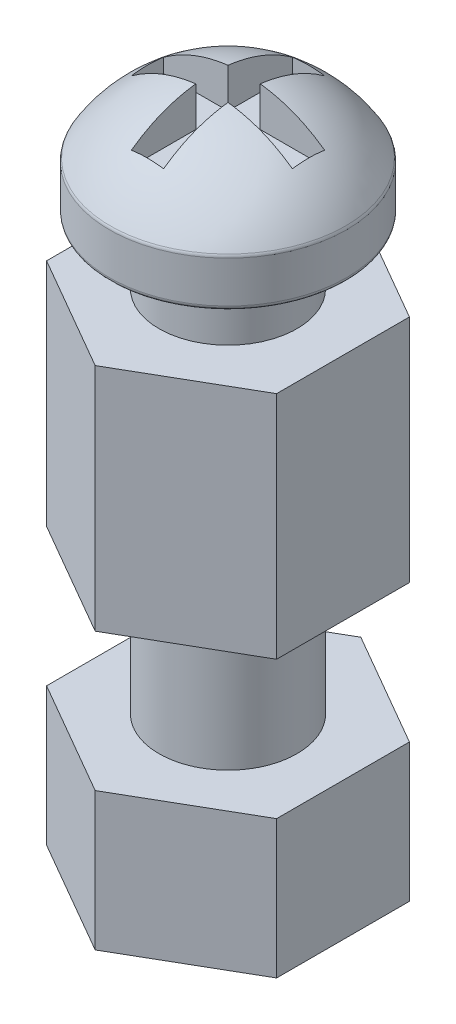
ISO-10303-21;
HEADER;
FILE_DESCRIPTION(('STEP AP214'),'2;1');
FILE_NAME('part.step','',(''),(''),'','','');
FILE_SCHEMA(('AUTOMOTIVE_DESIGN { 1 0 10303 214 1 1 1 1 }'));
ENDSEC;
DATA;
#1=APPLICATION_CONTEXT('core data for automotive mechanical design processes');
#2=APPLICATION_PROTOCOL_DEFINITION('international standard','automotive_design',2000,#1);
#3=PRODUCT_CONTEXT('',#1,'mechanical');
#4=PRODUCT('Part','Part','',(#3));
#5=PRODUCT_RELATED_PRODUCT_CATEGORY('part','',(#4));
#6=PRODUCT_DEFINITION_FORMATION('','',#4);
#7=PRODUCT_DEFINITION_CONTEXT('part definition',#1,'design');
#8=PRODUCT_DEFINITION('design','',#6,#7);
#9=PRODUCT_DEFINITION_SHAPE('','',#8);
#10=(LENGTH_UNIT() NAMED_UNIT(*) SI_UNIT(.MILLI.,.METRE.));
#11=(NAMED_UNIT(*) PLANE_ANGLE_UNIT() SI_UNIT($,.RADIAN.));
#12=(NAMED_UNIT(*) SI_UNIT($,.STERADIAN.) SOLID_ANGLE_UNIT());
#13=UNCERTAINTY_MEASURE_WITH_UNIT(LENGTH_MEASURE(1.E-05),#10,'distance_accuracy_value','');
#14=(GEOMETRIC_REPRESENTATION_CONTEXT(3) GLOBAL_UNCERTAINTY_ASSIGNED_CONTEXT((#13)) GLOBAL_UNIT_ASSIGNED_CONTEXT((#10,
#11,#12)) REPRESENTATION_CONTEXT('',''));
#15=CARTESIAN_POINT('',(0.,0.,0.));
#16=DIRECTION('',(0.,0.,1.));
#17=DIRECTION('',(1.,0.,0.));
#18=AXIS2_PLACEMENT_3D('',#15,#16,#17);
#19=CARTESIAN_POINT('',(2.5,-3.,-1.44337567297407));
#20=DIRECTION('',(1.,0.,0.));
#21=DIRECTION('',(0.,0.,-1.));
#22=AXIS2_PLACEMENT_3D('',#19,#20,#21);
#23=PLANE('',#22);
#24=DIRECTION('',(0.,0.,1.));
#25=VECTOR('',#24,1.);
#26=CARTESIAN_POINT('',(2.5,-6.,-1.44337567297407));
#27=LINE('',#26,#25);
#28=CARTESIAN_POINT('',(2.5,-6.,-1.44337567297407));
#29=VERTEX_POINT('',#28);
#30=CARTESIAN_POINT('',(2.5,-6.,1.44337567297407));
#31=VERTEX_POINT('',#30);
#32=EDGE_CURVE('E136',#29,#31,#27,.T.);
#33=ORIENTED_EDGE('',*,*,#32,.F.);
#34=DIRECTION('',(0.,-1.,0.));
#35=VECTOR('',#34,1.);
#36=CARTESIAN_POINT('',(2.5,-3.,-1.44337567297407));
#37=LINE('',#36,#35);
#38=CARTESIAN_POINT('',(2.5,-3.,-1.44337567297407));
#39=VERTEX_POINT('',#38);
#40=EDGE_CURVE('E12',#39,#29,#37,.T.);
#41=ORIENTED_EDGE('',*,*,#40,.F.);
#42=DIRECTION('',(0.,0.,1.));
#43=VECTOR('',#42,1.);
#44=CARTESIAN_POINT('',(2.5,-3.,-1.44337567297407));
#45=LINE('',#44,#43);
#46=CARTESIAN_POINT('',(2.5,-3.,1.44337567297407));
#47=VERTEX_POINT('',#46);
#48=EDGE_CURVE('E151',#39,#47,#45,.T.);
#49=ORIENTED_EDGE('',*,*,#48,.T.);
#50=DIRECTION('',(0.,-1.,0.));
#51=VECTOR('',#50,1.);
#52=CARTESIAN_POINT('',(2.5,-3.,1.44337567297407));
#53=LINE('',#52,#51);
#54=EDGE_CURVE('E54',#47,#31,#53,.T.);
#55=ORIENTED_EDGE('',*,*,#54,.T.);
#56=EDGE_LOOP('',(#33,#41,#49,#55));
#57=FACE_BOUND('',#56,.T.);
#58=ADVANCED_FACE('F51',(#57),#23,.T.);
#59=CARTESIAN_POINT('',(0.,-3.,-2.88675134594813));
#60=DIRECTION('',(0.5,0.,-0.866025403784439));
#61=DIRECTION('',(-0.866025403784439,0.,-0.5));
#62=AXIS2_PLACEMENT_3D('',#59,#60,#61);
#63=PLANE('',#62);
#64=DIRECTION('',(0.866025403784439,0.,0.5));
#65=VECTOR('',#64,1.);
#66=CARTESIAN_POINT('',(0.,-6.,-2.88675134594813));
#67=LINE('',#66,#65);
#68=CARTESIAN_POINT('',(0.,-6.,-2.88675134594813));
#69=VERTEX_POINT('',#68);
#70=EDGE_CURVE('E149',#69,#29,#67,.T.);
#71=ORIENTED_EDGE('',*,*,#70,.F.);
#72=DIRECTION('',(0.,-1.,0.));
#73=VECTOR('',#72,1.);
#74=CARTESIAN_POINT('',(0.,-3.,-2.88675134594813));
#75=LINE('',#74,#73);
#76=CARTESIAN_POINT('',(0.,-3.,-2.88675134594813));
#77=VERTEX_POINT('',#76);
#78=EDGE_CURVE('E60',#77,#69,#75,.T.);
#79=ORIENTED_EDGE('',*,*,#78,.F.);
#80=DIRECTION('',(0.866025403784439,0.,0.5));
#81=VECTOR('',#80,1.);
#82=CARTESIAN_POINT('',(0.,-3.,-2.88675134594813));
#83=LINE('',#82,#81);
#84=EDGE_CURVE('E126',#77,#39,#83,.T.);
#85=ORIENTED_EDGE('',*,*,#84,.T.);
#86=ORIENTED_EDGE('',*,*,#40,.T.);
#87=EDGE_LOOP('',(#71,#79,#85,#86));
#88=FACE_BOUND('',#87,.T.);
#89=ADVANCED_FACE('F159',(#88),#63,.T.);
#90=CARTESIAN_POINT('',(-2.5,-3.,-1.44337567297406));
#91=DIRECTION('',(-0.5,0.,-0.866025403784439));
#92=DIRECTION('',(-0.866025403784439,0.,0.5));
#93=AXIS2_PLACEMENT_3D('',#90,#91,#92);
#94=PLANE('',#93);
#95=DIRECTION('',(0.866025403784439,0.,-0.5));
#96=VECTOR('',#95,1.);
#97=CARTESIAN_POINT('',(-2.5,-6.,-1.44337567297406));
#98=LINE('',#97,#96);
#99=CARTESIAN_POINT('',(-2.5,-6.,-1.44337567297406));
#100=VERTEX_POINT('',#99);
#101=EDGE_CURVE('E113',#100,#69,#98,.T.);
#102=ORIENTED_EDGE('',*,*,#101,.F.);
#103=DIRECTION('',(0.,-1.,0.));
#104=VECTOR('',#103,1.);
#105=CARTESIAN_POINT('',(-2.5,-3.,-1.44337567297406));
#106=LINE('',#105,#104);
#107=CARTESIAN_POINT('',(-2.5,-3.,-1.44337567297406));
#108=VERTEX_POINT('',#107);
#109=EDGE_CURVE('E108',#108,#100,#106,.T.);
#110=ORIENTED_EDGE('',*,*,#109,.F.);
#111=DIRECTION('',(0.866025403784439,0.,-0.5));
#112=VECTOR('',#111,1.);
#113=CARTESIAN_POINT('',(-2.5,-3.,-1.44337567297406));
#114=LINE('',#113,#112);
#115=EDGE_CURVE('E111',#108,#77,#114,.T.);
#116=ORIENTED_EDGE('',*,*,#115,.T.);
#117=ORIENTED_EDGE('',*,*,#78,.T.);
#118=EDGE_LOOP('',(#102,#110,#116,#117));
#119=FACE_BOUND('',#118,.T.);
#120=ADVANCED_FACE('F110',(#119),#94,.T.);
#121=CARTESIAN_POINT('',(-2.5,-3.,1.44337567297406));
#122=DIRECTION('',(-1.,0.,0.));
#123=DIRECTION('',(0.,0.,1.));
#124=AXIS2_PLACEMENT_3D('',#121,#122,#123);
#125=PLANE('',#124);
#126=DIRECTION('',(0.,0.,-1.));
#127=VECTOR('',#126,1.);
#128=CARTESIAN_POINT('',(-2.5,-6.,1.44337567297406));
#129=LINE('',#128,#127);
#130=CARTESIAN_POINT('',(-2.5,-6.,1.44337567297406));
#131=VERTEX_POINT('',#130);
#132=EDGE_CURVE('E146',#131,#100,#129,.T.);
#133=ORIENTED_EDGE('',*,*,#132,.F.);
#134=DIRECTION('',(0.,-1.,0.));
#135=VECTOR('',#134,1.);
#136=CARTESIAN_POINT('',(-2.5,-3.,1.44337567297406));
#137=LINE('',#136,#135);
#138=CARTESIAN_POINT('',(-2.5,-3.,1.44337567297406));
#139=VERTEX_POINT('',#138);
#140=EDGE_CURVE('E118',#139,#131,#137,.T.);
#141=ORIENTED_EDGE('',*,*,#140,.F.);
#142=DIRECTION('',(0.,0.,-1.));
#143=VECTOR('',#142,1.);
#144=CARTESIAN_POINT('',(-2.5,-3.,1.44337567297406));
#145=LINE('',#144,#143);
#146=EDGE_CURVE('E124',#139,#108,#145,.T.);
#147=ORIENTED_EDGE('',*,*,#146,.T.);
#148=ORIENTED_EDGE('',*,*,#109,.T.);
#149=EDGE_LOOP('',(#133,#141,#147,#148));
#150=FACE_BOUND('',#149,.T.);
#151=ADVANCED_FACE('F128',(#150),#125,.T.);
#152=CARTESIAN_POINT('',(0.,-3.,2.88675134594813));
#153=DIRECTION('',(-0.5,0.,0.866025403784439));
#154=DIRECTION('',(0.866025403784439,0.,0.5));
#155=AXIS2_PLACEMENT_3D('',#152,#153,#154);
#156=PLANE('',#155);
#157=DIRECTION('',(-0.866025403784439,0.,-0.5));
#158=VECTOR('',#157,1.);
#159=CARTESIAN_POINT('',(0.,-6.,2.88675134594813));
#160=LINE('',#159,#158);
#161=CARTESIAN_POINT('',(0.,-6.,2.88675134594813));
#162=VERTEX_POINT('',#161);
#163=EDGE_CURVE('E143',#162,#131,#160,.T.);
#164=ORIENTED_EDGE('',*,*,#163,.F.);
#165=DIRECTION('',(0.,-1.,0.));
#166=VECTOR('',#165,1.);
#167=CARTESIAN_POINT('',(0.,-3.,2.88675134594813));
#168=LINE('',#167,#166);
#169=CARTESIAN_POINT('',(0.,-3.,2.88675134594813));
#170=VERTEX_POINT('',#169);
#171=EDGE_CURVE('E154',#170,#162,#168,.T.);
#172=ORIENTED_EDGE('',*,*,#171,.F.);
#173=DIRECTION('',(-0.866025403784439,0.,-0.5));
#174=VECTOR('',#173,1.);
#175=CARTESIAN_POINT('',(0.,-3.,2.88675134594813));
#176=LINE('',#175,#174);
#177=EDGE_CURVE('E129',#170,#139,#176,.T.);
#178=ORIENTED_EDGE('',*,*,#177,.T.);
#179=ORIENTED_EDGE('',*,*,#140,.T.);
#180=EDGE_LOOP('',(#164,#172,#178,#179));
#181=FACE_BOUND('',#180,.T.);
#182=ADVANCED_FACE('F172',(#181),#156,.T.);
#183=CARTESIAN_POINT('',(2.5,-3.,1.44337567297407));
#184=DIRECTION('',(0.5,0.,0.866025403784439));
#185=DIRECTION('',(0.866025403784439,0.,-0.5));
#186=AXIS2_PLACEMENT_3D('',#183,#184,#185);
#187=PLANE('',#186);
#188=DIRECTION('',(-0.866025403784439,0.,0.5));
#189=VECTOR('',#188,1.);
#190=CARTESIAN_POINT('',(2.5,-6.,1.44337567297407));
#191=LINE('',#190,#189);
#192=EDGE_CURVE('E139',#31,#162,#191,.T.);
#193=ORIENTED_EDGE('',*,*,#192,.F.);
#194=ORIENTED_EDGE('',*,*,#54,.F.);
#195=DIRECTION('',(-0.866025403784439,0.,0.5));
#196=VECTOR('',#195,1.);
#197=CARTESIAN_POINT('',(2.5,-3.,1.44337567297407));
#198=LINE('',#197,#196);
#199=EDGE_CURVE('E131',#47,#170,#198,.T.);
#200=ORIENTED_EDGE('',*,*,#199,.T.);
#201=ORIENTED_EDGE('',*,*,#171,.T.);
#202=EDGE_LOOP('',(#193,#194,#200,#201));
#203=FACE_BOUND('',#202,.T.);
#204=ADVANCED_FACE('F156',(#203),#187,.T.);
#205=CARTESIAN_POINT('',(0.,-3.,0.));
#206=DIRECTION('',(0.,-1.,0.));
#207=DIRECTION('',(0.,0.,-1.));
#208=AXIS2_PLACEMENT_3D('',#205,#206,#207);
#209=PLANE('',#208);
#210=CARTESIAN_POINT('',(0.,-3.,0.));
#211=DIRECTION('',(0.,-1.,0.));
#212=DIRECTION('',(0.,0.,-1.));
#213=AXIS2_PLACEMENT_3D('',#210,#211,#212);
#214=CIRCLE('',#213,1.5);
#215=CARTESIAN_POINT('',(0.,-3.,-1.5));
#216=VERTEX_POINT('',#215);
#217=EDGE_CURVE('E140',#216,#216,#214,.T.);
#218=ORIENTED_EDGE('',*,*,#217,.T.);
#219=EDGE_LOOP('',(#218));
#220=FACE_BOUND('',#219,.T.);
#221=ORIENTED_EDGE('',*,*,#48,.F.);
#222=ORIENTED_EDGE('',*,*,#84,.F.);
#223=ORIENTED_EDGE('',*,*,#115,.F.);
#224=ORIENTED_EDGE('',*,*,#146,.F.);
#225=ORIENTED_EDGE('',*,*,#177,.F.);
#226=ORIENTED_EDGE('',*,*,#199,.F.);
#227=EDGE_LOOP('',(#221,#222,#223,#224,#225,#226));
#228=FACE_BOUND('',#227,.T.);
#229=ADVANCED_FACE('F122',(#220,#228),#209,.F.);
#230=CARTESIAN_POINT('',(0.,-6.,0.));
#231=DIRECTION('',(0.,-1.,0.));
#232=DIRECTION('',(0.,0.,-1.));
#233=AXIS2_PLACEMENT_3D('',#230,#231,#232);
#234=PLANE('',#233);
#235=CARTESIAN_POINT('',(0.,-6.,0.));
#236=DIRECTION('',(0.,-1.,0.));
#237=DIRECTION('',(0.,0.,-1.));
#238=AXIS2_PLACEMENT_3D('',#235,#236,#237);
#239=CIRCLE('',#238,1.5);
#240=CARTESIAN_POINT('',(0.,-6.,-1.5));
#241=VERTEX_POINT('',#240);
#242=EDGE_CURVE('E195',#241,#241,#239,.T.);
#243=ORIENTED_EDGE('',*,*,#242,.F.);
#244=EDGE_LOOP('',(#243));
#245=FACE_BOUND('',#244,.T.);
#246=ORIENTED_EDGE('',*,*,#32,.T.);
#247=ORIENTED_EDGE('',*,*,#192,.T.);
#248=ORIENTED_EDGE('',*,*,#163,.T.);
#249=ORIENTED_EDGE('',*,*,#132,.T.);
#250=ORIENTED_EDGE('',*,*,#101,.T.);
#251=ORIENTED_EDGE('',*,*,#70,.T.);
#252=EDGE_LOOP('',(#246,#247,#248,#249,#250,#251));
#253=FACE_BOUND('',#252,.T.);
#254=ADVANCED_FACE('F158',(#245,#253),#234,.T.);
#255=CARTESIAN_POINT('',(0.,-3.,0.));
#256=DIRECTION('',(0.,-1.,0.));
#257=DIRECTION('',(0.,0.,-1.));
#258=AXIS2_PLACEMENT_3D('',#255,#256,#257);
#259=CYLINDRICAL_SURFACE('',#258,1.5);
#260=ORIENTED_EDGE('',*,*,#217,.F.);
#261=EDGE_LOOP('',(#260));
#262=FACE_BOUND('',#261,.T.);
#263=ORIENTED_EDGE('',*,*,#242,.T.);
#264=EDGE_LOOP('',(#263));
#265=FACE_BOUND('',#264,.T.);
#266=ADVANCED_FACE('F183',(#262,#265),#259,.F.);
#267=CLOSED_SHELL('',(#58,#89,#120,#151,#182,#204,#229,#254,#266));
#268=MANIFOLD_SOLID_BREP('B2',#267);
#269=CARTESIAN_POINT('',(1.25,5.,2.1650635094611));
#270=DIRECTION('',(-0.5,0.,-0.866025403784439));
#271=DIRECTION('',(-0.866025403784439,0.,0.5));
#272=AXIS2_PLACEMENT_3D('',#269,#270,#271);
#273=PLANE('',#272);
#274=DIRECTION('',(0.866025403784439,0.,-0.5));
#275=VECTOR('',#274,1.);
#276=CARTESIAN_POINT('',(1.25,0.,2.1650635094611));
#277=LINE('',#276,#275);
#278=CARTESIAN_POINT('',(0.,0.,2.88675134594813));
#279=VERTEX_POINT('',#278);
#280=CARTESIAN_POINT('',(2.5,0.,1.44337567297407));
#281=VERTEX_POINT('',#280);
#282=EDGE_CURVE('E350',#279,#281,#277,.T.);
#283=ORIENTED_EDGE('',*,*,#282,.T.);
#284=DIRECTION('',(0.,-1.,0.));
#285=VECTOR('',#284,1.);
#286=CARTESIAN_POINT('',(2.5,5.,1.44337567297407));
#287=LINE('',#286,#285);
#288=CARTESIAN_POINT('',(2.5,5.,1.44337567297407));
#289=VERTEX_POINT('',#288);
#290=EDGE_CURVE('E379',#289,#281,#287,.T.);
#291=ORIENTED_EDGE('',*,*,#290,.F.);
#292=DIRECTION('',(0.866025403784439,0.,-0.5));
#293=VECTOR('',#292,1.);
#294=CARTESIAN_POINT('',(1.25,5.,2.1650635094611));
#295=LINE('',#294,#293);
#296=CARTESIAN_POINT('',(0.,5.,2.88675134594813));
#297=VERTEX_POINT('',#296);
#298=EDGE_CURVE('E368',#297,#289,#295,.T.);
#299=ORIENTED_EDGE('',*,*,#298,.F.);
#300=DIRECTION('',(0.,-1.,0.));
#301=VECTOR('',#300,1.);
#302=CARTESIAN_POINT('',(0.,5.,2.88675134594813));
#303=LINE('',#302,#301);
#304=EDGE_CURVE('E346',#297,#279,#303,.T.);
#305=ORIENTED_EDGE('',*,*,#304,.T.);
#306=EDGE_LOOP('',(#283,#291,#299,#305));
#307=FACE_BOUND('',#306,.T.);
#308=ADVANCED_FACE('F248',(#307),#273,.F.);
#309=CARTESIAN_POINT('',(2.5,5.,0.));
#310=DIRECTION('',(-1.,0.,0.));
#311=DIRECTION('',(0.,0.,1.));
#312=AXIS2_PLACEMENT_3D('',#309,#310,#311);
#313=PLANE('',#312);
#314=DIRECTION('',(0.,0.,-1.));
#315=VECTOR('',#314,1.);
#316=CARTESIAN_POINT('',(2.5,0.,0.));
#317=LINE('',#316,#315);
#318=CARTESIAN_POINT('',(2.5,0.,-1.44337567297407));
#319=VERTEX_POINT('',#318);
#320=EDGE_CURVE('E354',#281,#319,#317,.T.);
#321=ORIENTED_EDGE('',*,*,#320,.T.);
#322=DIRECTION('',(0.,-1.,0.));
#323=VECTOR('',#322,1.);
#324=CARTESIAN_POINT('',(2.5,5.,-1.44337567297407));
#325=LINE('',#324,#323);
#326=CARTESIAN_POINT('',(2.5,5.,-1.44337567297407));
#327=VERTEX_POINT('',#326);
#328=EDGE_CURVE('E375',#327,#319,#325,.T.);
#329=ORIENTED_EDGE('',*,*,#328,.F.);
#330=DIRECTION('',(0.,0.,-1.));
#331=VECTOR('',#330,1.);
#332=CARTESIAN_POINT('',(2.5,5.,0.));
#333=LINE('',#332,#331);
#334=EDGE_CURVE('E309',#289,#327,#333,.T.);
#335=ORIENTED_EDGE('',*,*,#334,.F.);
#336=ORIENTED_EDGE('',*,*,#290,.T.);
#337=EDGE_LOOP('',(#321,#329,#335,#336));
#338=FACE_BOUND('',#337,.T.);
#339=ADVANCED_FACE('F448',(#338),#313,.F.);
#340=CARTESIAN_POINT('',(1.25,5.,-2.1650635094611));
#341=DIRECTION('',(-0.5,0.,0.866025403784439));
#342=DIRECTION('',(0.866025403784439,0.,0.5));
#343=AXIS2_PLACEMENT_3D('',#340,#341,#342);
#344=PLANE('',#343);
#345=DIRECTION('',(-0.866025403784439,0.,-0.5));
#346=VECTOR('',#345,1.);
#347=CARTESIAN_POINT('',(1.25,0.,-2.1650635094611));
#348=LINE('',#347,#346);
#349=CARTESIAN_POINT('',(0.,0.,-2.88675134594813));
#350=VERTEX_POINT('',#349);
#351=EDGE_CURVE('E358',#319,#350,#348,.T.);
#352=ORIENTED_EDGE('',*,*,#351,.T.);
#353=DIRECTION('',(0.,-1.,0.));
#354=VECTOR('',#353,1.);
#355=CARTESIAN_POINT('',(0.,5.,-2.88675134594813));
#356=LINE('',#355,#354);
#357=CARTESIAN_POINT('',(0.,5.,-2.88675134594813));
#358=VERTEX_POINT('',#357);
#359=EDGE_CURVE('E339',#358,#350,#356,.T.);
#360=ORIENTED_EDGE('',*,*,#359,.F.);
#361=DIRECTION('',(-0.866025403784439,0.,-0.5));
#362=VECTOR('',#361,1.);
#363=CARTESIAN_POINT('',(1.25,5.,-2.1650635094611));
#364=LINE('',#363,#362);
#365=EDGE_CURVE('E325',#327,#358,#364,.T.);
#366=ORIENTED_EDGE('',*,*,#365,.F.);
#367=ORIENTED_EDGE('',*,*,#328,.T.);
#368=EDGE_LOOP('',(#352,#360,#366,#367));
#369=FACE_BOUND('',#368,.T.);
#370=ADVANCED_FACE('F453',(#369),#344,.F.);
#371=CARTESIAN_POINT('',(-1.25,5.,-2.1650635094611));
#372=DIRECTION('',(0.5,0.,0.866025403784439));
#373=DIRECTION('',(0.866025403784439,0.,-0.5));
#374=AXIS2_PLACEMENT_3D('',#371,#372,#373);
#375=PLANE('',#374);
#376=DIRECTION('',(-0.866025403784439,0.,0.5));
#377=VECTOR('',#376,1.);
#378=CARTESIAN_POINT('',(-1.25,0.,-2.1650635094611));
#379=LINE('',#378,#377);
#380=CARTESIAN_POINT('',(-2.5,0.,-1.44337567297406));
#381=VERTEX_POINT('',#380);
#382=EDGE_CURVE('E335',#350,#381,#379,.T.);
#383=ORIENTED_EDGE('',*,*,#382,.T.);
#384=DIRECTION('',(0.,-1.,0.));
#385=VECTOR('',#384,1.);
#386=CARTESIAN_POINT('',(-2.5,5.,-1.44337567297406));
#387=LINE('',#386,#385);
#388=CARTESIAN_POINT('',(-2.5,5.,-1.44337567297406));
#389=VERTEX_POINT('',#388);
#390=EDGE_CURVE('E332',#389,#381,#387,.T.);
#391=ORIENTED_EDGE('',*,*,#390,.F.);
#392=DIRECTION('',(-0.866025403784439,0.,0.5));
#393=VECTOR('',#392,1.);
#394=CARTESIAN_POINT('',(-1.25,5.,-2.1650635094611));
#395=LINE('',#394,#393);
#396=EDGE_CURVE('E318',#358,#389,#395,.T.);
#397=ORIENTED_EDGE('',*,*,#396,.F.);
#398=ORIENTED_EDGE('',*,*,#359,.T.);
#399=EDGE_LOOP('',(#383,#391,#397,#398));
#400=FACE_BOUND('',#399,.T.);
#401=ADVANCED_FACE('F333',(#400),#375,.F.);
#402=CARTESIAN_POINT('',(-2.5,5.,0.));
#403=DIRECTION('',(1.,0.,0.));
#404=DIRECTION('',(0.,0.,-1.));
#405=AXIS2_PLACEMENT_3D('',#402,#403,#404);
#406=PLANE('',#405);
#407=DIRECTION('',(0.,0.,1.));
#408=VECTOR('',#407,1.);
#409=CARTESIAN_POINT('',(-2.5,0.,0.));
#410=LINE('',#409,#408);
#411=CARTESIAN_POINT('',(-2.5,0.,1.44337567297406));
#412=VERTEX_POINT('',#411);
#413=EDGE_CURVE('E363',#381,#412,#410,.T.);
#414=ORIENTED_EDGE('',*,*,#413,.T.);
#415=DIRECTION('',(0.,-1.,0.));
#416=VECTOR('',#415,1.);
#417=CARTESIAN_POINT('',(-2.5,5.,1.44337567297406));
#418=LINE('',#417,#416);
#419=CARTESIAN_POINT('',(-2.5,5.,1.44337567297406));
#420=VERTEX_POINT('',#419);
#421=EDGE_CURVE('E340',#420,#412,#418,.T.);
#422=ORIENTED_EDGE('',*,*,#421,.F.);
#423=DIRECTION('',(0.,0.,1.));
#424=VECTOR('',#423,1.);
#425=CARTESIAN_POINT('',(-2.5,5.,0.));
#426=LINE('',#425,#424);
#427=EDGE_CURVE('E322',#389,#420,#426,.T.);
#428=ORIENTED_EDGE('',*,*,#427,.F.);
#429=ORIENTED_EDGE('',*,*,#390,.T.);
#430=EDGE_LOOP('',(#414,#422,#428,#429));
#431=FACE_BOUND('',#430,.T.);
#432=ADVANCED_FACE('F342',(#431),#406,.F.);
#433=CARTESIAN_POINT('',(-1.25,5.,2.1650635094611));
#434=DIRECTION('',(0.5,0.,-0.866025403784439));
#435=DIRECTION('',(-0.866025403784439,0.,-0.5));
#436=AXIS2_PLACEMENT_3D('',#433,#434,#435);
#437=PLANE('',#436);
#438=DIRECTION('',(0.866025403784439,0.,0.5));
#439=VECTOR('',#438,1.);
#440=CARTESIAN_POINT('',(-1.25,0.,2.1650635094611));
#441=LINE('',#440,#439);
#442=EDGE_CURVE('E300',#412,#279,#441,.T.);
#443=ORIENTED_EDGE('',*,*,#442,.T.);
#444=ORIENTED_EDGE('',*,*,#304,.F.);
#445=DIRECTION('',(0.866025403784439,0.,0.5));
#446=VECTOR('',#445,1.);
#447=CARTESIAN_POINT('',(-1.25,5.,2.1650635094611));
#448=LINE('',#447,#446);
#449=EDGE_CURVE('E273',#420,#297,#448,.T.);
#450=ORIENTED_EDGE('',*,*,#449,.F.);
#451=ORIENTED_EDGE('',*,*,#421,.T.);
#452=EDGE_LOOP('',(#443,#444,#450,#451));
#453=FACE_BOUND('',#452,.T.);
#454=ADVANCED_FACE('F463',(#453),#437,.F.);
#455=CARTESIAN_POINT('',(0.,5.,0.));
#456=DIRECTION('',(0.,1.,0.));
#457=DIRECTION('',(0.,0.,1.));
#458=AXIS2_PLACEMENT_3D('',#455,#456,#457);
#459=PLANE('',#458);
#460=CARTESIAN_POINT('',(0.,5.,0.));
#461=DIRECTION('',(0.,1.,0.));
#462=DIRECTION('',(-1.,0.,0.));
#463=AXIS2_PLACEMENT_3D('',#460,#461,#462);
#464=CIRCLE('',#463,1.5);
#465=CARTESIAN_POINT('',(-1.5,5.,0.));
#466=VERTEX_POINT('',#465);
#467=EDGE_CURVE('E382',#466,#466,#464,.T.);
#468=ORIENTED_EDGE('',*,*,#467,.F.);
#469=EDGE_LOOP('',(#468));
#470=FACE_BOUND('',#469,.T.);
#471=ORIENTED_EDGE('',*,*,#298,.T.);
#472=ORIENTED_EDGE('',*,*,#334,.T.);
#473=ORIENTED_EDGE('',*,*,#365,.T.);
#474=ORIENTED_EDGE('',*,*,#396,.T.);
#475=ORIENTED_EDGE('',*,*,#427,.T.);
#476=ORIENTED_EDGE('',*,*,#449,.T.);
#477=EDGE_LOOP('',(#471,#472,#473,#474,#475,#476));
#478=FACE_BOUND('',#477,.T.);
#479=ADVANCED_FACE('F320',(#470,#478),#459,.T.);
#480=CARTESIAN_POINT('',(0.,0.,0.));
#481=DIRECTION('',(0.,1.,0.));
#482=DIRECTION('',(0.,0.,1.));
#483=AXIS2_PLACEMENT_3D('',#480,#481,#482);
#484=PLANE('',#483);
#485=CARTESIAN_POINT('',(0.,0.,0.));
#486=DIRECTION('',(0.,1.,0.));
#487=DIRECTION('',(0.,0.,1.));
#488=AXIS2_PLACEMENT_3D('',#485,#486,#487);
#489=CIRCLE('',#488,1.5);
#490=CARTESIAN_POINT('',(0.,0.,1.5));
#491=VERTEX_POINT('',#490);
#492=EDGE_CURVE('E600',#491,#491,#489,.T.);
#493=ORIENTED_EDGE('',*,*,#492,.T.);
#494=EDGE_LOOP('',(#493));
#495=FACE_BOUND('',#494,.T.);
#496=ORIENTED_EDGE('',*,*,#282,.F.);
#497=ORIENTED_EDGE('',*,*,#442,.F.);
#498=ORIENTED_EDGE('',*,*,#413,.F.);
#499=ORIENTED_EDGE('',*,*,#382,.F.);
#500=ORIENTED_EDGE('',*,*,#351,.F.);
#501=ORIENTED_EDGE('',*,*,#320,.F.);
#502=EDGE_LOOP('',(#496,#497,#498,#499,#500,#501));
#503=FACE_BOUND('',#502,.T.);
#504=ADVANCED_FACE('F466',(#495,#503),#484,.F.);
#505=CARTESIAN_POINT('',(0.,-6.,0.));
#506=DIRECTION('',(0.,1.,0.));
#507=DIRECTION('',(0.,0.,1.));
#508=AXIS2_PLACEMENT_3D('',#505,#506,#507);
#509=CYLINDRICAL_SURFACE('',#508,1.5);
#510=CARTESIAN_POINT('',(0.,-6.,0.));
#511=DIRECTION('',(0.,1.,0.));
#512=DIRECTION('',(0.,0.,1.));
#513=AXIS2_PLACEMENT_3D('',#510,#511,#512);
#514=CIRCLE('',#513,1.5);
#515=CARTESIAN_POINT('',(0.,-6.,1.5));
#516=VERTEX_POINT('',#515);
#517=EDGE_CURVE('E355',#516,#516,#514,.T.);
#518=ORIENTED_EDGE('',*,*,#517,.T.);
#519=EDGE_LOOP('',(#518));
#520=FACE_BOUND('',#519,.T.);
#521=ORIENTED_EDGE('',*,*,#492,.F.);
#522=EDGE_LOOP('',(#521));
#523=FACE_BOUND('',#522,.T.);
#524=ADVANCED_FACE('F469',(#520,#523),#509,.T.);
#525=CARTESIAN_POINT('',(0.,-6.,0.));
#526=DIRECTION('',(0.,1.,0.));
#527=DIRECTION('',(0.,0.,1.));
#528=AXIS2_PLACEMENT_3D('',#525,#526,#527);
#529=PLANE('',#528);
#530=ORIENTED_EDGE('',*,*,#517,.F.);
#531=EDGE_LOOP('',(#530));
#532=FACE_BOUND('',#531,.T.);
#533=ADVANCED_FACE('F476',(#532),#529,.F.);
#534=CARTESIAN_POINT('',(0.,5.,0.));
#535=DIRECTION('',(0.,1.,0.));
#536=DIRECTION('',(-1.,0.,0.));
#537=AXIS2_PLACEMENT_3D('',#534,#535,#536);
#538=CYLINDRICAL_SURFACE('',#537,1.5);
#539=CARTESIAN_POINT('',(0.,6.4,0.));
#540=DIRECTION('',(0.,1.,0.));
#541=DIRECTION('',(-1.,0.,0.));
#542=AXIS2_PLACEMENT_3D('',#539,#540,#541);
#543=CIRCLE('',#542,1.5);
#544=CARTESIAN_POINT('',(-1.5,6.4,0.));
#545=VERTEX_POINT('',#544);
#546=EDGE_CURVE('E596',#545,#545,#543,.T.);
#547=ORIENTED_EDGE('',*,*,#546,.F.);
#548=EDGE_LOOP('',(#547));
#549=FACE_BOUND('',#548,.T.);
#550=ORIENTED_EDGE('',*,*,#467,.T.);
#551=EDGE_LOOP('',(#550));
#552=FACE_BOUND('',#551,.T.);
#553=ADVANCED_FACE('F480',(#549,#552),#538,.T.);
#554=CARTESIAN_POINT('',(0.,6.4,0.));
#555=DIRECTION('',(0.,1.,0.));
#556=DIRECTION('',(-1.,0.,0.));
#557=AXIS2_PLACEMENT_3D('',#554,#555,#556);
#558=PLANE('',#557);
#559=CARTESIAN_POINT('',(0.,6.4,0.));
#560=DIRECTION('',(0.,1.,0.));
#561=DIRECTION('',(-1.,0.,0.));
#562=AXIS2_PLACEMENT_3D('',#559,#560,#561);
#563=CIRCLE('',#562,2.47767710879357);
#564=CARTESIAN_POINT('',(-2.47767710879357,6.4,0.));
#565=VERTEX_POINT('',#564);
#566=EDGE_CURVE('E49',#565,#565,#563,.F.);
#567=ORIENTED_EDGE('',*,*,#566,.T.);
#568=EDGE_LOOP('',(#567));
#569=FACE_BOUND('',#568,.T.);
#570=ORIENTED_EDGE('',*,*,#546,.T.);
#571=EDGE_LOOP('',(#570));
#572=FACE_BOUND('',#571,.T.);
#573=ADVANCED_FACE('F484',(#569,#572),#558,.F.);
#574=CARTESIAN_POINT('',(0.,5.,0.));
#575=DIRECTION('',(0.,1.,0.));
#576=DIRECTION('',(-1.,0.,0.));
#577=AXIS2_PLACEMENT_3D('',#574,#575,#576);
#578=CYLINDRICAL_SURFACE('',#577,2.57767710879357);
#579=CARTESIAN_POINT('',(0.,6.5,0.));
#580=DIRECTION('',(0.,1.,0.));
#581=DIRECTION('',(-1.,0.,0.));
#582=AXIS2_PLACEMENT_3D('',#579,#580,#581);
#583=CIRCLE('',#582,2.57767710879357);
#584=CARTESIAN_POINT('',(-2.57767710879357,6.5,0.));
#585=VERTEX_POINT('',#584);
#586=EDGE_CURVE('E257',#585,#585,#583,.T.);
#587=ORIENTED_EDGE('',*,*,#586,.T.);
#588=EDGE_LOOP('',(#587));
#589=FACE_BOUND('',#588,.T.);
#590=CARTESIAN_POINT('',(0.,7.4,0.));
#591=DIRECTION('',(0.,1.,0.));
#592=DIRECTION('',(-1.,0.,0.));
#593=AXIS2_PLACEMENT_3D('',#590,#591,#592);
#594=CIRCLE('',#593,2.57767710879357);
#595=CARTESIAN_POINT('',(-2.57767710879357,7.4,0.));
#596=VERTEX_POINT('',#595);
#597=EDGE_CURVE('E592',#596,#596,#594,.T.);
#598=ORIENTED_EDGE('',*,*,#597,.F.);
#599=EDGE_LOOP('',(#598));
#600=FACE_BOUND('',#599,.T.);
#601=ADVANCED_FACE('F434',(#589,#600),#578,.T.);
#602=CARTESIAN_POINT('',(0.,7.4,0.));
#603=DIRECTION('',(0.,1.,0.));
#604=DIRECTION('',(-1.,0.,0.));
#605=AXIS2_PLACEMENT_3D('',#602,#603,#604);
#606=TOROIDAL_SURFACE('',#605,2.45267710879357,0.125);
#607=CARTESIAN_POINT('',(0.,7.46521739130435,0.));
#608=DIRECTION('',(0.,1.,0.));
#609=DIRECTION('',(-1.,0.,0.));
#610=AXIS2_PLACEMENT_3D('',#607,#608,#609);
#611=CIRCLE('',#610,2.55931524395851);
#612=CARTESIAN_POINT('',(-2.55931524395851,7.46521739130435,0.));
#613=VERTEX_POINT('',#612);
#614=EDGE_CURVE('E561',#613,#613,#611,.T.);
#615=ORIENTED_EDGE('',*,*,#614,.F.);
#616=EDGE_LOOP('',(#615));
#617=FACE_BOUND('',#616,.T.);
#618=ORIENTED_EDGE('',*,*,#597,.T.);
#619=EDGE_LOOP('',(#618));
#620=FACE_BOUND('',#619,.T.);
#621=ADVANCED_FACE('F491',(#617,#620),#606,.T.);
#622=CARTESIAN_POINT('',(0.,5.9,0.));
#623=DIRECTION('',(0.,1.,0.));
#624=DIRECTION('',(1.,0.,0.));
#625=AXIS2_PLACEMENT_3D('',#622,#623,#624);
#626=SPHERICAL_SURFACE('',#625,3.);
#627=CARTESIAN_POINT('',(0.35,5.9,0.));
#628=DIRECTION('',(1.,0.,0.));
#629=DIRECTION('',(0.,0.,-1.));
#630=AXIS2_PLACEMENT_3D('',#627,#628,#629);
#631=CIRCLE('',#630,2.97951338308792);
#632=CARTESIAN_POINT('',(0.35,8.8588849251027,0.35));
#633=VERTEX_POINT('',#632);
#634=CARTESIAN_POINT('',(0.35,8.3114311103575,1.75));
#635=VERTEX_POINT('',#634);
#636=EDGE_CURVE('E383',#633,#635,#631,.T.);
#637=ORIENTED_EDGE('',*,*,#636,.T.);
#638=CARTESIAN_POINT('',(0.,5.9,1.75));
#639=DIRECTION('',(0.,0.,1.));
#640=DIRECTION('',(1.,0.,0.));
#641=AXIS2_PLACEMENT_3D('',#638,#639,#640);
#642=CIRCLE('',#641,2.43669858620224);
#643=CARTESIAN_POINT('',(-0.35,8.3114311103575,1.75));
#644=VERTEX_POINT('',#643);
#645=EDGE_CURVE('E427',#635,#644,#642,.T.);
#646=ORIENTED_EDGE('',*,*,#645,.T.);
#647=CARTESIAN_POINT('',(-0.35,5.9,0.));
#648=DIRECTION('',(1.,0.,0.));
#649=DIRECTION('',(0.,0.,-1.));
#650=AXIS2_PLACEMENT_3D('',#647,#648,#649);
#651=CIRCLE('',#650,2.97951338308792);
#652=CARTESIAN_POINT('',(-0.35,8.8588849251027,0.35));
#653=VERTEX_POINT('',#652);
#654=EDGE_CURVE('E423',#653,#644,#651,.T.);
#655=ORIENTED_EDGE('',*,*,#654,.F.);
#656=CARTESIAN_POINT('',(0.,5.9,0.35));
#657=DIRECTION('',(0.,0.,1.));
#658=DIRECTION('',(1.,0.,0.));
#659=AXIS2_PLACEMENT_3D('',#656,#657,#658);
#660=CIRCLE('',#659,2.97951338308792);
#661=CARTESIAN_POINT('',(-1.75,8.3114311103575,0.35));
#662=VERTEX_POINT('',#661);
#663=EDGE_CURVE('E419',#653,#662,#660,.T.);
#664=ORIENTED_EDGE('',*,*,#663,.T.);
#665=CARTESIAN_POINT('',(-1.75,5.9,0.));
#666=DIRECTION('',(1.,0.,0.));
#667=DIRECTION('',(0.,0.,-1.));
#668=AXIS2_PLACEMENT_3D('',#665,#666,#667);
#669=CIRCLE('',#668,2.43669858620224);
#670=CARTESIAN_POINT('',(-1.75,8.3114311103575,-0.35));
#671=VERTEX_POINT('',#670);
#672=EDGE_CURVE('E415',#671,#662,#669,.T.);
#673=ORIENTED_EDGE('',*,*,#672,.F.);
#674=CARTESIAN_POINT('',(0.,5.9,-0.35));
#675=DIRECTION('',(0.,0.,1.));
#676=DIRECTION('',(1.,0.,0.));
#677=AXIS2_PLACEMENT_3D('',#674,#675,#676);
#678=CIRCLE('',#677,2.97951338308792);
#679=CARTESIAN_POINT('',(-0.35,8.8588849251027,-0.35));
#680=VERTEX_POINT('',#679);
#681=EDGE_CURVE('E411',#680,#671,#678,.T.);
#682=ORIENTED_EDGE('',*,*,#681,.F.);
#683=CARTESIAN_POINT('',(-0.35,5.9,0.));
#684=DIRECTION('',(1.,0.,0.));
#685=DIRECTION('',(0.,0.,-1.));
#686=AXIS2_PLACEMENT_3D('',#683,#684,#685);
#687=CIRCLE('',#686,2.97951338308792);
#688=CARTESIAN_POINT('',(-0.35,8.3114311103575,-1.75));
#689=VERTEX_POINT('',#688);
#690=EDGE_CURVE('E407',#689,#680,#687,.T.);
#691=ORIENTED_EDGE('',*,*,#690,.F.);
#692=CARTESIAN_POINT('',(0.,5.9,-1.75));
#693=DIRECTION('',(0.,0.,1.));
#694=DIRECTION('',(1.,0.,0.));
#695=AXIS2_PLACEMENT_3D('',#692,#693,#694);
#696=CIRCLE('',#695,2.43669858620224);
#697=CARTESIAN_POINT('',(0.35,8.3114311103575,-1.75));
#698=VERTEX_POINT('',#697);
#699=EDGE_CURVE('E403',#698,#689,#696,.T.);
#700=ORIENTED_EDGE('',*,*,#699,.F.);
#701=CARTESIAN_POINT('',(0.35,5.9,0.));
#702=DIRECTION('',(1.,0.,0.));
#703=DIRECTION('',(0.,0.,-1.));
#704=AXIS2_PLACEMENT_3D('',#701,#702,#703);
#705=CIRCLE('',#704,2.97951338308792);
#706=CARTESIAN_POINT('',(0.35,8.8588849251027,-0.35));
#707=VERTEX_POINT('',#706);
#708=EDGE_CURVE('E399',#698,#707,#705,.T.);
#709=ORIENTED_EDGE('',*,*,#708,.T.);
#710=CARTESIAN_POINT('',(0.,5.9,-0.35));
#711=DIRECTION('',(0.,0.,1.));
#712=DIRECTION('',(1.,0.,0.));
#713=AXIS2_PLACEMENT_3D('',#710,#711,#712);
#714=CIRCLE('',#713,2.97951338308792);
#715=CARTESIAN_POINT('',(1.75,8.3114311103575,-0.35));
#716=VERTEX_POINT('',#715);
#717=EDGE_CURVE('E395',#716,#707,#714,.T.);
#718=ORIENTED_EDGE('',*,*,#717,.F.);
#719=CARTESIAN_POINT('',(1.75,5.9,0.));
#720=DIRECTION('',(1.,0.,0.));
#721=DIRECTION('',(0.,0.,-1.));
#722=AXIS2_PLACEMENT_3D('',#719,#720,#721);
#723=CIRCLE('',#722,2.43669858620224);
#724=CARTESIAN_POINT('',(1.75,8.3114311103575,0.35));
#725=VERTEX_POINT('',#724);
#726=EDGE_CURVE('E391',#716,#725,#723,.T.);
#727=ORIENTED_EDGE('',*,*,#726,.T.);
#728=CARTESIAN_POINT('',(0.,5.9,0.35));
#729=DIRECTION('',(0.,0.,1.));
#730=DIRECTION('',(1.,0.,0.));
#731=AXIS2_PLACEMENT_3D('',#728,#729,#730);
#732=CIRCLE('',#731,2.97951338308792);
#733=EDGE_CURVE('E387',#725,#633,#732,.T.);
#734=ORIENTED_EDGE('',*,*,#733,.T.);
#735=EDGE_LOOP('',(#637,#646,#655,#664,#673,#682,#691,#700,#709,#718,#727,#734));
#736=FACE_BOUND('',#735,.T.);
#737=ORIENTED_EDGE('',*,*,#614,.T.);
#738=EDGE_LOOP('',(#737));
#739=FACE_BOUND('',#738,.T.);
#740=ADVANCED_FACE('F494',(#736,#739),#626,.T.);
#741=CARTESIAN_POINT('',(0.,8.,1.75));
#742=DIRECTION('',(0.,0.,1.));
#743=DIRECTION('',(1.,0.,0.));
#744=AXIS2_PLACEMENT_3D('',#741,#742,#743);
#745=PLANE('',#744);
#746=DIRECTION('',(0.,1.,0.));
#747=VECTOR('',#746,1.);
#748=CARTESIAN_POINT('',(0.35,8.,1.75));
#749=LINE('',#748,#747);
#750=CARTESIAN_POINT('',(0.35,8.,1.75));
#751=VERTEX_POINT('',#750);
#752=EDGE_CURVE('E264',#751,#635,#749,.T.);
#753=ORIENTED_EDGE('',*,*,#752,.F.);
#754=DIRECTION('',(1.,0.,0.));
#755=VECTOR('',#754,1.);
#756=CARTESIAN_POINT('',(0.,8.,1.75));
#757=LINE('',#756,#755);
#758=CARTESIAN_POINT('',(-0.35,8.,1.75));
#759=VERTEX_POINT('',#758);
#760=EDGE_CURVE('E559',#759,#751,#757,.T.);
#761=ORIENTED_EDGE('',*,*,#760,.F.);
#762=DIRECTION('',(0.,1.,0.));
#763=VECTOR('',#762,1.);
#764=CARTESIAN_POINT('',(-0.35,8.,1.75));
#765=LINE('',#764,#763);
#766=EDGE_CURVE('E552',#759,#644,#765,.T.);
#767=ORIENTED_EDGE('',*,*,#766,.T.);
#768=ORIENTED_EDGE('',*,*,#645,.F.);
#769=EDGE_LOOP('',(#753,#761,#767,#768));
#770=FACE_BOUND('',#769,.T.);
#771=ADVANCED_FACE('F498',(#770),#745,.F.);
#772=CARTESIAN_POINT('',(-0.35,8.,0.));
#773=DIRECTION('',(1.,0.,0.));
#774=DIRECTION('',(0.,0.,-1.));
#775=AXIS2_PLACEMENT_3D('',#772,#773,#774);
#776=PLANE('',#775);
#777=ORIENTED_EDGE('',*,*,#654,.T.);
#778=ORIENTED_EDGE('',*,*,#766,.F.);
#779=DIRECTION('',(0.,0.,-1.));
#780=VECTOR('',#779,1.);
#781=CARTESIAN_POINT('',(-0.35,8.,0.));
#782=LINE('',#781,#780);
#783=CARTESIAN_POINT('',(-0.35,8.,0.35));
#784=VERTEX_POINT('',#783);
#785=EDGE_CURVE('E585',#759,#784,#782,.T.);
#786=ORIENTED_EDGE('',*,*,#785,.T.);
#787=DIRECTION('',(0.,1.,0.));
#788=VECTOR('',#787,1.);
#789=CARTESIAN_POINT('',(-0.35,8.,0.35));
#790=LINE('',#789,#788);
#791=EDGE_CURVE('E556',#784,#653,#790,.T.);
#792=ORIENTED_EDGE('',*,*,#791,.T.);
#793=EDGE_LOOP('',(#777,#778,#786,#792));
#794=FACE_BOUND('',#793,.T.);
#795=ADVANCED_FACE('F502',(#794),#776,.T.);
#796=CARTESIAN_POINT('',(0.,8.,0.35));
#797=DIRECTION('',(0.,0.,1.));
#798=DIRECTION('',(1.,0.,0.));
#799=AXIS2_PLACEMENT_3D('',#796,#797,#798);
#800=PLANE('',#799);
#801=ORIENTED_EDGE('',*,*,#791,.F.);
#802=DIRECTION('',(1.,0.,0.));
#803=VECTOR('',#802,1.);
#804=CARTESIAN_POINT('',(0.,8.,0.35));
#805=LINE('',#804,#803);
#806=CARTESIAN_POINT('',(-1.75,8.,0.35));
#807=VERTEX_POINT('',#806);
#808=EDGE_CURVE('E649',#807,#784,#805,.T.);
#809=ORIENTED_EDGE('',*,*,#808,.F.);
#810=DIRECTION('',(0.,1.,0.));
#811=VECTOR('',#810,1.);
#812=CARTESIAN_POINT('',(-1.75,8.,0.35));
#813=LINE('',#812,#811);
#814=EDGE_CURVE('E616',#807,#662,#813,.T.);
#815=ORIENTED_EDGE('',*,*,#814,.T.);
#816=ORIENTED_EDGE('',*,*,#663,.F.);
#817=EDGE_LOOP('',(#801,#809,#815,#816));
#818=FACE_BOUND('',#817,.T.);
#819=ADVANCED_FACE('F537',(#818),#800,.F.);
#820=CARTESIAN_POINT('',(-1.75,8.,0.));
#821=DIRECTION('',(1.,0.,0.));
#822=DIRECTION('',(0.,0.,-1.));
#823=AXIS2_PLACEMENT_3D('',#820,#821,#822);
#824=PLANE('',#823);
#825=ORIENTED_EDGE('',*,*,#672,.T.);
#826=ORIENTED_EDGE('',*,*,#814,.F.);
#827=DIRECTION('',(0.,0.,-1.));
#828=VECTOR('',#827,1.);
#829=CARTESIAN_POINT('',(-1.75,8.,0.));
#830=LINE('',#829,#828);
#831=CARTESIAN_POINT('',(-1.75,8.,-0.35));
#832=VERTEX_POINT('',#831);
#833=EDGE_CURVE('E653',#807,#832,#830,.T.);
#834=ORIENTED_EDGE('',*,*,#833,.T.);
#835=DIRECTION('',(0.,1.,0.));
#836=VECTOR('',#835,1.);
#837=CARTESIAN_POINT('',(-1.75,8.,-0.35));
#838=LINE('',#837,#836);
#839=EDGE_CURVE('E620',#832,#671,#838,.T.);
#840=ORIENTED_EDGE('',*,*,#839,.T.);
#841=EDGE_LOOP('',(#825,#826,#834,#840));
#842=FACE_BOUND('',#841,.T.);
#843=ADVANCED_FACE('F533',(#842),#824,.T.);
#844=CARTESIAN_POINT('',(0.,8.,-0.35));
#845=DIRECTION('',(0.,0.,1.));
#846=DIRECTION('',(1.,0.,0.));
#847=AXIS2_PLACEMENT_3D('',#844,#845,#846);
#848=PLANE('',#847);
#849=ORIENTED_EDGE('',*,*,#681,.T.);
#850=ORIENTED_EDGE('',*,*,#839,.F.);
#851=DIRECTION('',(1.,0.,0.));
#852=VECTOR('',#851,1.);
#853=CARTESIAN_POINT('',(0.,8.,-0.35));
#854=LINE('',#853,#852);
#855=CARTESIAN_POINT('',(-0.35,8.,-0.35));
#856=VERTEX_POINT('',#855);
#857=EDGE_CURVE('E657',#832,#856,#854,.T.);
#858=ORIENTED_EDGE('',*,*,#857,.T.);
#859=DIRECTION('',(0.,1.,0.));
#860=VECTOR('',#859,1.);
#861=CARTESIAN_POINT('',(-0.35,8.,-0.35));
#862=LINE('',#861,#860);
#863=EDGE_CURVE('E624',#856,#680,#862,.T.);
#864=ORIENTED_EDGE('',*,*,#863,.T.);
#865=EDGE_LOOP('',(#849,#850,#858,#864));
#866=FACE_BOUND('',#865,.T.);
#867=ADVANCED_FACE('F529',(#866),#848,.T.);
#868=CARTESIAN_POINT('',(-0.35,8.,0.));
#869=DIRECTION('',(1.,0.,0.));
#870=DIRECTION('',(0.,0.,-1.));
#871=AXIS2_PLACEMENT_3D('',#868,#869,#870);
#872=PLANE('',#871);
#873=ORIENTED_EDGE('',*,*,#690,.T.);
#874=ORIENTED_EDGE('',*,*,#863,.F.);
#875=DIRECTION('',(0.,0.,-1.));
#876=VECTOR('',#875,1.);
#877=CARTESIAN_POINT('',(-0.35,8.,0.));
#878=LINE('',#877,#876);
#879=CARTESIAN_POINT('',(-0.35,8.,-1.75));
#880=VERTEX_POINT('',#879);
#881=EDGE_CURVE('E661',#856,#880,#878,.T.);
#882=ORIENTED_EDGE('',*,*,#881,.T.);
#883=DIRECTION('',(0.,1.,0.));
#884=VECTOR('',#883,1.);
#885=CARTESIAN_POINT('',(-0.35,8.,-1.75));
#886=LINE('',#885,#884);
#887=EDGE_CURVE('E628',#880,#689,#886,.T.);
#888=ORIENTED_EDGE('',*,*,#887,.T.);
#889=EDGE_LOOP('',(#873,#874,#882,#888));
#890=FACE_BOUND('',#889,.T.);
#891=ADVANCED_FACE('F525',(#890),#872,.T.);
#892=CARTESIAN_POINT('',(0.,8.,-1.75));
#893=DIRECTION('',(0.,0.,1.));
#894=DIRECTION('',(1.,0.,0.));
#895=AXIS2_PLACEMENT_3D('',#892,#893,#894);
#896=PLANE('',#895);
#897=ORIENTED_EDGE('',*,*,#699,.T.);
#898=ORIENTED_EDGE('',*,*,#887,.F.);
#899=DIRECTION('',(1.,0.,0.));
#900=VECTOR('',#899,1.);
#901=CARTESIAN_POINT('',(0.,8.,-1.75));
#902=LINE('',#901,#900);
#903=CARTESIAN_POINT('',(0.35,8.,-1.75));
#904=VERTEX_POINT('',#903);
#905=EDGE_CURVE('E665',#880,#904,#902,.T.);
#906=ORIENTED_EDGE('',*,*,#905,.T.);
#907=DIRECTION('',(0.,1.,0.));
#908=VECTOR('',#907,1.);
#909=CARTESIAN_POINT('',(0.35,8.,-1.75));
#910=LINE('',#909,#908);
#911=EDGE_CURVE('E632',#904,#698,#910,.T.);
#912=ORIENTED_EDGE('',*,*,#911,.T.);
#913=EDGE_LOOP('',(#897,#898,#906,#912));
#914=FACE_BOUND('',#913,.T.);
#915=ADVANCED_FACE('F521',(#914),#896,.T.);
#916=CARTESIAN_POINT('',(0.35,8.,0.));
#917=DIRECTION('',(1.,0.,0.));
#918=DIRECTION('',(0.,0.,-1.));
#919=AXIS2_PLACEMENT_3D('',#916,#917,#918);
#920=PLANE('',#919);
#921=ORIENTED_EDGE('',*,*,#911,.F.);
#922=DIRECTION('',(0.,0.,-1.));
#923=VECTOR('',#922,1.);
#924=CARTESIAN_POINT('',(0.35,8.,0.));
#925=LINE('',#924,#923);
#926=CARTESIAN_POINT('',(0.35,8.,-0.35));
#927=VERTEX_POINT('',#926);
#928=EDGE_CURVE('E669',#927,#904,#925,.T.);
#929=ORIENTED_EDGE('',*,*,#928,.F.);
#930=DIRECTION('',(0.,1.,0.));
#931=VECTOR('',#930,1.);
#932=CARTESIAN_POINT('',(0.35,8.,-0.35));
#933=LINE('',#932,#931);
#934=EDGE_CURVE('E636',#927,#707,#933,.T.);
#935=ORIENTED_EDGE('',*,*,#934,.T.);
#936=ORIENTED_EDGE('',*,*,#708,.F.);
#937=EDGE_LOOP('',(#921,#929,#935,#936));
#938=FACE_BOUND('',#937,.T.);
#939=ADVANCED_FACE('F517',(#938),#920,.F.);
#940=CARTESIAN_POINT('',(0.,8.,-0.35));
#941=DIRECTION('',(0.,0.,1.));
#942=DIRECTION('',(1.,0.,0.));
#943=AXIS2_PLACEMENT_3D('',#940,#941,#942);
#944=PLANE('',#943);
#945=ORIENTED_EDGE('',*,*,#717,.T.);
#946=ORIENTED_EDGE('',*,*,#934,.F.);
#947=DIRECTION('',(1.,0.,0.));
#948=VECTOR('',#947,1.);
#949=CARTESIAN_POINT('',(0.,8.,-0.35));
#950=LINE('',#949,#948);
#951=CARTESIAN_POINT('',(1.75,8.,-0.35));
#952=VERTEX_POINT('',#951);
#953=EDGE_CURVE('E673',#927,#952,#950,.T.);
#954=ORIENTED_EDGE('',*,*,#953,.T.);
#955=DIRECTION('',(0.,1.,0.));
#956=VECTOR('',#955,1.);
#957=CARTESIAN_POINT('',(1.75,8.,-0.35));
#958=LINE('',#957,#956);
#959=EDGE_CURVE('E583',#952,#716,#958,.T.);
#960=ORIENTED_EDGE('',*,*,#959,.T.);
#961=EDGE_LOOP('',(#945,#946,#954,#960));
#962=FACE_BOUND('',#961,.T.);
#963=ADVANCED_FACE('F513',(#962),#944,.T.);
#964=CARTESIAN_POINT('',(1.75,8.,0.));
#965=DIRECTION('',(1.,0.,0.));
#966=DIRECTION('',(0.,0.,-1.));
#967=AXIS2_PLACEMENT_3D('',#964,#965,#966);
#968=PLANE('',#967);
#969=ORIENTED_EDGE('',*,*,#959,.F.);
#970=DIRECTION('',(0.,0.,-1.));
#971=VECTOR('',#970,1.);
#972=CARTESIAN_POINT('',(1.75,8.,0.));
#973=LINE('',#972,#971);
#974=CARTESIAN_POINT('',(1.75,8.,0.35));
#975=VERTEX_POINT('',#974);
#976=EDGE_CURVE('E676',#975,#952,#973,.T.);
#977=ORIENTED_EDGE('',*,*,#976,.F.);
#978=DIRECTION('',(0.,1.,0.));
#979=VECTOR('',#978,1.);
#980=CARTESIAN_POINT('',(1.75,8.,0.35));
#981=LINE('',#980,#979);
#982=EDGE_CURVE('E579',#975,#725,#981,.T.);
#983=ORIENTED_EDGE('',*,*,#982,.T.);
#984=ORIENTED_EDGE('',*,*,#726,.F.);
#985=EDGE_LOOP('',(#969,#977,#983,#984));
#986=FACE_BOUND('',#985,.T.);
#987=ADVANCED_FACE('F509',(#986),#968,.F.);
#988=CARTESIAN_POINT('',(0.,8.,0.35));
#989=DIRECTION('',(0.,0.,1.));
#990=DIRECTION('',(1.,0.,0.));
#991=AXIS2_PLACEMENT_3D('',#988,#989,#990);
#992=PLANE('',#991);
#993=ORIENTED_EDGE('',*,*,#982,.F.);
#994=DIRECTION('',(1.,0.,0.));
#995=VECTOR('',#994,1.);
#996=CARTESIAN_POINT('',(0.,8.,0.35));
#997=LINE('',#996,#995);
#998=CARTESIAN_POINT('',(0.35,8.,0.35));
#999=VERTEX_POINT('',#998);
#1000=EDGE_CURVE('E576',#999,#975,#997,.T.);
#1001=ORIENTED_EDGE('',*,*,#1000,.F.);
#1002=DIRECTION('',(0.,1.,0.));
#1003=VECTOR('',#1002,1.);
#1004=CARTESIAN_POINT('',(0.35,8.,0.35));
#1005=LINE('',#1004,#1003);
#1006=EDGE_CURVE('E569',#999,#633,#1005,.T.);
#1007=ORIENTED_EDGE('',*,*,#1006,.T.);
#1008=ORIENTED_EDGE('',*,*,#733,.F.);
#1009=EDGE_LOOP('',(#993,#1001,#1007,#1008));
#1010=FACE_BOUND('',#1009,.T.);
#1011=ADVANCED_FACE('F506',(#1010),#992,.F.);
#1012=CARTESIAN_POINT('',(0.35,8.,0.));
#1013=DIRECTION('',(1.,0.,0.));
#1014=DIRECTION('',(0.,0.,-1.));
#1015=AXIS2_PLACEMENT_3D('',#1012,#1013,#1014);
#1016=PLANE('',#1015);
#1017=ORIENTED_EDGE('',*,*,#1006,.F.);
#1018=DIRECTION('',(0.,0.,-1.));
#1019=VECTOR('',#1018,1.);
#1020=CARTESIAN_POINT('',(0.35,8.,0.));
#1021=LINE('',#1020,#1019);
#1022=EDGE_CURVE('E682',#751,#999,#1021,.T.);
#1023=ORIENTED_EDGE('',*,*,#1022,.F.);
#1024=ORIENTED_EDGE('',*,*,#752,.T.);
#1025=ORIENTED_EDGE('',*,*,#636,.F.);
#1026=EDGE_LOOP('',(#1017,#1023,#1024,#1025));
#1027=FACE_BOUND('',#1026,.T.);
#1028=ADVANCED_FACE('F443',(#1027),#1016,.F.);
#1029=CARTESIAN_POINT('',(0.,8.,0.));
#1030=DIRECTION('',(0.,1.,0.));
#1031=DIRECTION('',(0.,0.,1.));
#1032=AXIS2_PLACEMENT_3D('',#1029,#1030,#1031);
#1033=PLANE('',#1032);
#1034=ORIENTED_EDGE('',*,*,#760,.T.);
#1035=ORIENTED_EDGE('',*,*,#1022,.T.);
#1036=ORIENTED_EDGE('',*,*,#1000,.T.);
#1037=ORIENTED_EDGE('',*,*,#976,.T.);
#1038=ORIENTED_EDGE('',*,*,#953,.F.);
#1039=ORIENTED_EDGE('',*,*,#928,.T.);
#1040=ORIENTED_EDGE('',*,*,#905,.F.);
#1041=ORIENTED_EDGE('',*,*,#881,.F.);
#1042=ORIENTED_EDGE('',*,*,#857,.F.);
#1043=ORIENTED_EDGE('',*,*,#833,.F.);
#1044=ORIENTED_EDGE('',*,*,#808,.T.);
#1045=ORIENTED_EDGE('',*,*,#785,.F.);
#1046=EDGE_LOOP('',(#1034,#1035,#1036,#1037,#1038,#1039,#1040,#1041,#1042,#1043,#1044,#1045));
#1047=FACE_BOUND('',#1046,.T.);
#1048=ADVANCED_FACE('F438',(#1047),#1033,.T.);
#1049=CARTESIAN_POINT('',(0.,6.5,0.));
#1050=DIRECTION('',(0.,1.,0.));
#1051=DIRECTION('',(-1.,0.,0.));
#1052=AXIS2_PLACEMENT_3D('',#1049,#1050,#1051);
#1053=TOROIDAL_SURFACE('',#1052,2.47767710879357,0.1);
#1054=ORIENTED_EDGE('',*,*,#566,.F.);
#1055=EDGE_LOOP('',(#1054));
#1056=FACE_BOUND('',#1055,.T.);
#1057=ORIENTED_EDGE('',*,*,#586,.F.);
#1058=EDGE_LOOP('',(#1057));
#1059=FACE_BOUND('',#1058,.T.);
#1060=ADVANCED_FACE('F250',(#1056,#1059),#1053,.T.);
#1061=CLOSED_SHELL('',(#308,#339,#370,#401,#432,#454,#479,#504,#524,#533,#553,#573,#601,#621,
#740,#771,#795,#819,#843,#867,#891,#915,#939,#963,#987,#1011,#1028,#1048,#1060));
#1062=MANIFOLD_SOLID_BREP('B6',#1061);
#1063=ADVANCED_BREP_SHAPE_REPRESENTATION('',(#18,#268,#1062),#14);
#1064=SHAPE_DEFINITION_REPRESENTATION(#9,#1063);
ENDSEC;
END-ISO-10303-21;
